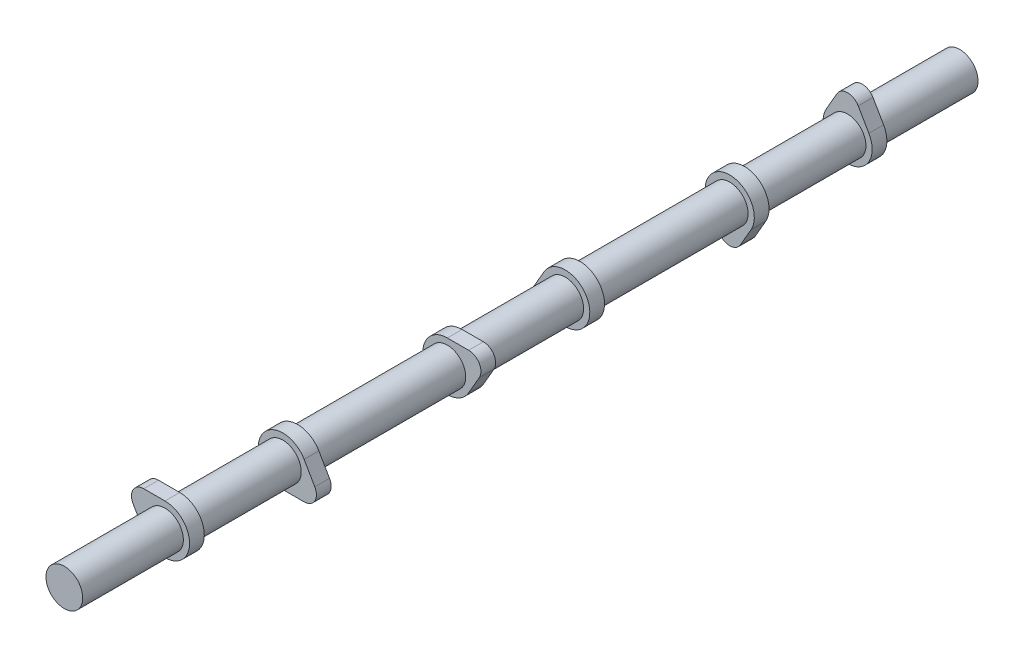
ISO-10303-21;
HEADER;
FILE_DESCRIPTION(('STEP AP214'),'2;1');
FILE_NAME('part.step','',(''),(''),'','','');
FILE_SCHEMA(('AUTOMOTIVE_DESIGN { 1 0 10303 214 1 1 1 1 }'));
ENDSEC;
DATA;
#1=APPLICATION_CONTEXT('core data for automotive mechanical design processes');
#2=APPLICATION_PROTOCOL_DEFINITION('international standard','automotive_design',2000,#1);
#3=PRODUCT_CONTEXT('',#1,'mechanical');
#4=PRODUCT('Part','Part','',(#3));
#5=PRODUCT_RELATED_PRODUCT_CATEGORY('part','',(#4));
#6=PRODUCT_DEFINITION_FORMATION('','',#4);
#7=PRODUCT_DEFINITION_CONTEXT('part definition',#1,'design');
#8=PRODUCT_DEFINITION('design','',#6,#7);
#9=PRODUCT_DEFINITION_SHAPE('','',#8);
#10=(LENGTH_UNIT() NAMED_UNIT(*) SI_UNIT(.MILLI.,.METRE.));
#11=(NAMED_UNIT(*) PLANE_ANGLE_UNIT() SI_UNIT($,.RADIAN.));
#12=(NAMED_UNIT(*) SI_UNIT($,.STERADIAN.) SOLID_ANGLE_UNIT());
#13=UNCERTAINTY_MEASURE_WITH_UNIT(LENGTH_MEASURE(1.E-05),#10,'distance_accuracy_value','');
#14=(GEOMETRIC_REPRESENTATION_CONTEXT(3) GLOBAL_UNCERTAINTY_ASSIGNED_CONTEXT((#13)) GLOBAL_UNIT_ASSIGNED_CONTEXT((#10,
#11,#12)) REPRESENTATION_CONTEXT('',''));
#15=CARTESIAN_POINT('',(0.,0.,0.));
#16=DIRECTION('',(0.,0.,1.));
#17=DIRECTION('',(1.,0.,0.));
#18=AXIS2_PLACEMENT_3D('',#15,#16,#17);
#19=CARTESIAN_POINT('',(0.,0.,120.65));
#20=DIRECTION('',(0.,0.,-1.));
#21=DIRECTION('',(-1.,0.,0.));
#22=AXIS2_PLACEMENT_3D('',#19,#20,#21);
#23=CYLINDRICAL_SURFACE('',#22,9.5);
#24=CARTESIAN_POINT('',(0.,0.,7.62));
#25=DIRECTION('',(0.,0.,1.));
#26=DIRECTION('',(1.,0.,0.));
#27=AXIS2_PLACEMENT_3D('',#24,#25,#26);
#28=CIRCLE('',#27,9.5);
#29=CARTESIAN_POINT('',(9.5,0.,7.62));
#30=VERTEX_POINT('',#29);
#31=EDGE_CURVE('E388',#30,#30,#28,.F.);
#32=ORIENTED_EDGE('',*,*,#31,.F.);
#33=EDGE_LOOP('',(#32));
#34=FACE_BOUND('',#33,.T.);
#35=CARTESIAN_POINT('',(0.,0.,60.96));
#36=DIRECTION('',(0.,0.,1.));
#37=DIRECTION('',(1.,0.,0.));
#38=AXIS2_PLACEMENT_3D('',#35,#36,#37);
#39=CIRCLE('',#38,9.5);
#40=CARTESIAN_POINT('',(9.5,0.,60.96));
#41=VERTEX_POINT('',#40);
#42=EDGE_CURVE('E11',#41,#41,#39,.T.);
#43=ORIENTED_EDGE('',*,*,#42,.F.);
#44=EDGE_LOOP('',(#43));
#45=FACE_BOUND('',#44,.T.);
#46=ADVANCED_FACE('F35',(#34,#45),#23,.T.);
#47=CARTESIAN_POINT('',(0.,0.,7.62));
#48=DIRECTION('',(0.,0.,-1.));
#49=DIRECTION('',(-1.,0.,0.));
#50=AXIS2_PLACEMENT_3D('',#47,#48,#49);
#51=CYLINDRICAL_SURFACE('',#50,12.7);
#52=CARTESIAN_POINT('',(0.,0.,0.));
#53=DIRECTION('',(0.,0.,1.));
#54=DIRECTION('',(1.,0.,0.));
#55=AXIS2_PLACEMENT_3D('',#52,#53,#54);
#56=CIRCLE('',#55,12.7);
#57=CARTESIAN_POINT('',(-10.9985226280624,6.35,0.));
#58=VERTEX_POINT('',#57);
#59=CARTESIAN_POINT('',(10.9985226280624,6.35,0.));
#60=VERTEX_POINT('',#59);
#61=EDGE_CURVE('E391',#58,#60,#56,.T.);
#62=ORIENTED_EDGE('',*,*,#61,.T.);
#63=DIRECTION('',(0.,0.,-1.));
#64=VECTOR('',#63,1.);
#65=CARTESIAN_POINT('',(10.9985226280624,6.35,7.62));
#66=LINE('',#65,#64);
#67=CARTESIAN_POINT('',(10.9985226280624,6.35,7.62));
#68=VERTEX_POINT('',#67);
#69=EDGE_CURVE('E410',#68,#60,#66,.T.);
#70=ORIENTED_EDGE('',*,*,#69,.F.);
#71=CARTESIAN_POINT('',(0.,0.,7.62));
#72=DIRECTION('',(0.,0.,1.));
#73=DIRECTION('',(1.,0.,0.));
#74=AXIS2_PLACEMENT_3D('',#71,#72,#73);
#75=CIRCLE('',#74,12.7);
#76=CARTESIAN_POINT('',(-10.9985226280624,6.35,7.62));
#77=VERTEX_POINT('',#76);
#78=EDGE_CURVE('E392',#77,#68,#75,.T.);
#79=ORIENTED_EDGE('',*,*,#78,.F.);
#80=DIRECTION('',(0.,0.,-1.));
#81=VECTOR('',#80,1.);
#82=CARTESIAN_POINT('',(-10.9985226280624,6.35,7.62));
#83=LINE('',#82,#81);
#84=EDGE_CURVE('E398',#77,#58,#83,.T.);
#85=ORIENTED_EDGE('',*,*,#84,.T.);
#86=EDGE_LOOP('',(#62,#70,#79,#85));
#87=FACE_BOUND('',#86,.T.);
#88=ADVANCED_FACE('F37',(#87),#51,.T.);
#89=CARTESIAN_POINT('',(10.9985226280624,6.35,7.62));
#90=DIRECTION('',(-0.866025403784439,-0.5,0.));
#91=DIRECTION('',(0.5,-0.866025403784439,0.));
#92=AXIS2_PLACEMENT_3D('',#89,#90,#91);
#93=PLANE('',#92);
#94=DIRECTION('',(-0.5,0.866025403784439,0.));
#95=VECTOR('',#94,1.);
#96=CARTESIAN_POINT('',(10.9985226280624,6.35,0.));
#97=LINE('',#96,#95);
#98=CARTESIAN_POINT('',(5.49926131403119,15.875,0.));
#99=VERTEX_POINT('',#98);
#100=EDGE_CURVE('E401',#60,#99,#97,.T.);
#101=ORIENTED_EDGE('',*,*,#100,.T.);
#102=DIRECTION('',(0.,0.,-1.));
#103=VECTOR('',#102,1.);
#104=CARTESIAN_POINT('',(5.49926131403119,15.875,7.62));
#105=LINE('',#104,#103);
#106=CARTESIAN_POINT('',(5.49926131403119,15.875,7.62));
#107=VERTEX_POINT('',#106);
#108=EDGE_CURVE('E408',#107,#99,#105,.T.);
#109=ORIENTED_EDGE('',*,*,#108,.F.);
#110=DIRECTION('',(-0.5,0.866025403784439,0.));
#111=VECTOR('',#110,1.);
#112=CARTESIAN_POINT('',(10.9985226280624,6.35,7.62));
#113=LINE('',#112,#111);
#114=EDGE_CURVE('E85',#68,#107,#113,.T.);
#115=ORIENTED_EDGE('',*,*,#114,.F.);
#116=ORIENTED_EDGE('',*,*,#69,.T.);
#117=EDGE_LOOP('',(#101,#109,#115,#116));
#118=FACE_BOUND('',#117,.T.);
#119=ADVANCED_FACE('F430',(#118),#93,.F.);
#120=CARTESIAN_POINT('',(0.,12.7,7.62));
#121=DIRECTION('',(0.,0.,-1.));
#122=DIRECTION('',(-1.,0.,0.));
#123=AXIS2_PLACEMENT_3D('',#120,#121,#122);
#124=CYLINDRICAL_SURFACE('',#123,6.35);
#125=CARTESIAN_POINT('',(0.,12.7,0.));
#126=DIRECTION('',(0.,0.,1.));
#127=DIRECTION('',(1.,0.,0.));
#128=AXIS2_PLACEMENT_3D('',#125,#126,#127);
#129=CIRCLE('',#128,6.35);
#130=CARTESIAN_POINT('',(-5.49926131403118,15.875,0.));
#131=VERTEX_POINT('',#130);
#132=EDGE_CURVE('E71',#99,#131,#129,.T.);
#133=ORIENTED_EDGE('',*,*,#132,.T.);
#134=DIRECTION('',(0.,0.,-1.));
#135=VECTOR('',#134,1.);
#136=CARTESIAN_POINT('',(-5.49926131403118,15.875,7.62));
#137=LINE('',#136,#135);
#138=CARTESIAN_POINT('',(-5.49926131403118,15.875,7.62));
#139=VERTEX_POINT('',#138);
#140=EDGE_CURVE('E406',#139,#131,#137,.T.);
#141=ORIENTED_EDGE('',*,*,#140,.F.);
#142=CARTESIAN_POINT('',(0.,12.7,7.62));
#143=DIRECTION('',(0.,0.,1.));
#144=DIRECTION('',(1.,0.,0.));
#145=AXIS2_PLACEMENT_3D('',#142,#143,#144);
#146=CIRCLE('',#145,6.35);
#147=EDGE_CURVE('E395',#107,#139,#146,.T.);
#148=ORIENTED_EDGE('',*,*,#147,.F.);
#149=ORIENTED_EDGE('',*,*,#108,.T.);
#150=EDGE_LOOP('',(#133,#141,#148,#149));
#151=FACE_BOUND('',#150,.T.);
#152=ADVANCED_FACE('F429',(#151),#124,.T.);
#153=CARTESIAN_POINT('',(-10.9985226280624,6.35,7.62));
#154=DIRECTION('',(0.866025403784439,-0.5,0.));
#155=DIRECTION('',(0.5,0.866025403784439,0.));
#156=AXIS2_PLACEMENT_3D('',#153,#154,#155);
#157=PLANE('',#156);
#158=DIRECTION('',(-0.5,-0.866025403784439,0.));
#159=VECTOR('',#158,1.);
#160=CARTESIAN_POINT('',(-10.9985226280624,6.35,0.));
#161=LINE('',#160,#159);
#162=EDGE_CURVE('E77',#131,#58,#161,.T.);
#163=ORIENTED_EDGE('',*,*,#162,.T.);
#164=ORIENTED_EDGE('',*,*,#84,.F.);
#165=DIRECTION('',(-0.5,-0.866025403784439,0.));
#166=VECTOR('',#165,1.);
#167=CARTESIAN_POINT('',(-10.9985226280624,6.35,7.62));
#168=LINE('',#167,#166);
#169=EDGE_CURVE('E53',#139,#77,#168,.T.);
#170=ORIENTED_EDGE('',*,*,#169,.F.);
#171=ORIENTED_EDGE('',*,*,#140,.T.);
#172=EDGE_LOOP('',(#163,#164,#170,#171));
#173=FACE_BOUND('',#172,.T.);
#174=ADVANCED_FACE('F427',(#173),#157,.F.);
#175=CARTESIAN_POINT('',(0.,0.,7.62));
#176=DIRECTION('',(0.,0.,1.));
#177=DIRECTION('',(1.,0.,0.));
#178=AXIS2_PLACEMENT_3D('',#175,#176,#177);
#179=PLANE('',#178);
#180=ORIENTED_EDGE('',*,*,#31,.T.);
#181=EDGE_LOOP('',(#180));
#182=FACE_BOUND('',#181,.T.);
#183=ORIENTED_EDGE('',*,*,#78,.T.);
#184=ORIENTED_EDGE('',*,*,#114,.T.);
#185=ORIENTED_EDGE('',*,*,#147,.T.);
#186=ORIENTED_EDGE('',*,*,#169,.T.);
#187=EDGE_LOOP('',(#183,#184,#185,#186));
#188=FACE_BOUND('',#187,.T.);
#189=ADVANCED_FACE('F421',(#182,#188),#179,.T.);
#190=CARTESIAN_POINT('',(0.,0.,0.));
#191=DIRECTION('',(0.,0.,1.));
#192=DIRECTION('',(1.,0.,0.));
#193=AXIS2_PLACEMENT_3D('',#190,#191,#192);
#194=PLANE('',#193);
#195=CARTESIAN_POINT('',(0.,0.,0.));
#196=DIRECTION('',(0.,0.,1.));
#197=DIRECTION('',(1.,0.,0.));
#198=AXIS2_PLACEMENT_3D('',#195,#196,#197);
#199=CIRCLE('',#198,9.5);
#200=CARTESIAN_POINT('',(9.5,0.,0.));
#201=VERTEX_POINT('',#200);
#202=EDGE_CURVE('E45',#201,#201,#199,.F.);
#203=ORIENTED_EDGE('',*,*,#202,.F.);
#204=EDGE_LOOP('',(#203));
#205=FACE_BOUND('',#204,.T.);
#206=ORIENTED_EDGE('',*,*,#61,.F.);
#207=ORIENTED_EDGE('',*,*,#162,.F.);
#208=ORIENTED_EDGE('',*,*,#132,.F.);
#209=ORIENTED_EDGE('',*,*,#100,.F.);
#210=EDGE_LOOP('',(#206,#207,#208,#209));
#211=FACE_BOUND('',#210,.T.);
#212=ADVANCED_FACE('F418',(#205,#211),#194,.F.);
#213=ORIENTED_EDGE('',*,*,#202,.T.);
#214=EDGE_LOOP('',(#213));
#215=FACE_BOUND('',#214,.T.);
#216=CARTESIAN_POINT('',(0.,0.,-50.34));
#217=DIRECTION('',(0.,0.,-1.));
#218=DIRECTION('',(-1.,0.,0.));
#219=AXIS2_PLACEMENT_3D('',#216,#217,#218);
#220=CIRCLE('',#219,9.5);
#221=CARTESIAN_POINT('',(-9.5,0.,-50.34));
#222=VERTEX_POINT('',#221);
#223=EDGE_CURVE('E353',#222,#222,#220,.T.);
#224=ORIENTED_EDGE('',*,*,#223,.F.);
#225=EDGE_LOOP('',(#224));
#226=FACE_BOUND('',#225,.T.);
#227=ADVANCED_FACE('F415',(#215,#226),#23,.T.);
#228=CARTESIAN_POINT('',(0.,0.,68.58));
#229=DIRECTION('',(0.,0.,-1.));
#230=DIRECTION('',(1.,0.,0.));
#231=AXIS2_PLACEMENT_3D('',#228,#229,#230);
#232=CYLINDRICAL_SURFACE('',#231,12.7);
#233=CARTESIAN_POINT('',(0.,0.,60.96));
#234=DIRECTION('',(0.,0.,1.));
#235=DIRECTION('',(-1.,0.,0.));
#236=AXIS2_PLACEMENT_3D('',#233,#234,#235);
#237=CIRCLE('',#236,12.7);
#238=CARTESIAN_POINT('',(10.9985226280623,-6.35000000000008,60.96));
#239=VERTEX_POINT('',#238);
#240=CARTESIAN_POINT('',(-10.9985226280624,-6.34999999999992,60.96));
#241=VERTEX_POINT('',#240);
#242=EDGE_CURVE('E358',#239,#241,#237,.T.);
#243=ORIENTED_EDGE('',*,*,#242,.T.);
#244=DIRECTION('',(0.,0.,-1.));
#245=VECTOR('',#244,1.);
#246=CARTESIAN_POINT('',(-10.9985226280624,-6.34999999999992,68.58));
#247=LINE('',#246,#245);
#248=CARTESIAN_POINT('',(-10.9985226280624,-6.34999999999992,68.58));
#249=VERTEX_POINT('',#248);
#250=EDGE_CURVE('E385',#249,#241,#247,.T.);
#251=ORIENTED_EDGE('',*,*,#250,.F.);
#252=CARTESIAN_POINT('',(0.,0.,68.58));
#253=DIRECTION('',(0.,0.,1.));
#254=DIRECTION('',(-1.,0.,0.));
#255=AXIS2_PLACEMENT_3D('',#252,#253,#254);
#256=CIRCLE('',#255,12.7);
#257=CARTESIAN_POINT('',(10.9985226280623,-6.35000000000008,68.58));
#258=VERTEX_POINT('',#257);
#259=EDGE_CURVE('E359',#258,#249,#256,.T.);
#260=ORIENTED_EDGE('',*,*,#259,.F.);
#261=DIRECTION('',(0.,0.,-1.));
#262=VECTOR('',#261,1.);
#263=CARTESIAN_POINT('',(10.9985226280623,-6.35000000000008,68.58));
#264=LINE('',#263,#262);
#265=EDGE_CURVE('E369',#258,#239,#264,.T.);
#266=ORIENTED_EDGE('',*,*,#265,.T.);
#267=EDGE_LOOP('',(#243,#251,#260,#266));
#268=FACE_BOUND('',#267,.T.);
#269=ADVANCED_FACE('F448',(#268),#232,.T.);
#270=CARTESIAN_POINT('',(-10.9985226280624,-6.34999999999992,68.58));
#271=DIRECTION('',(0.866025403784442,0.499999999999994,0.));
#272=DIRECTION('',(-0.499999999999994,0.866025403784442,0.));
#273=AXIS2_PLACEMENT_3D('',#270,#271,#272);
#274=PLANE('',#273);
#275=DIRECTION('',(0.499999999999994,-0.866025403784442,0.));
#276=VECTOR('',#275,1.);
#277=CARTESIAN_POINT('',(-10.9985226280624,-6.34999999999992,60.96));
#278=LINE('',#277,#276);
#279=CARTESIAN_POINT('',(-5.4992613140313,-15.875,60.96));
#280=VERTEX_POINT('',#279);
#281=EDGE_CURVE('E372',#241,#280,#278,.T.);
#282=ORIENTED_EDGE('',*,*,#281,.T.);
#283=DIRECTION('',(0.,0.,-1.));
#284=VECTOR('',#283,1.);
#285=CARTESIAN_POINT('',(-5.4992613140313,-15.875,68.58));
#286=LINE('',#285,#284);
#287=CARTESIAN_POINT('',(-5.4992613140313,-15.875,68.58));
#288=VERTEX_POINT('',#287);
#289=EDGE_CURVE('E382',#288,#280,#286,.T.);
#290=ORIENTED_EDGE('',*,*,#289,.F.);
#291=DIRECTION('',(0.499999999999994,-0.866025403784442,0.));
#292=VECTOR('',#291,1.);
#293=CARTESIAN_POINT('',(-10.9985226280624,-6.34999999999992,68.58));
#294=LINE('',#293,#292);
#295=EDGE_CURVE('E362',#249,#288,#294,.T.);
#296=ORIENTED_EDGE('',*,*,#295,.F.);
#297=ORIENTED_EDGE('',*,*,#250,.T.);
#298=EDGE_LOOP('',(#282,#290,#296,#297));
#299=FACE_BOUND('',#298,.T.);
#300=ADVANCED_FACE('F520',(#299),#274,.F.);
#301=CARTESIAN_POINT('',(0.,-12.7,68.58));
#302=DIRECTION('',(0.,0.,-1.));
#303=DIRECTION('',(1.,0.,0.));
#304=AXIS2_PLACEMENT_3D('',#301,#302,#303);
#305=CYLINDRICAL_SURFACE('',#304,6.35);
#306=CARTESIAN_POINT('',(0.,-12.7,60.96));
#307=DIRECTION('',(0.,0.,1.));
#308=DIRECTION('',(-1.,0.,0.));
#309=AXIS2_PLACEMENT_3D('',#306,#307,#308);
#310=CIRCLE('',#309,6.35);
#311=CARTESIAN_POINT('',(5.49926131403107,-15.875,60.96));
#312=VERTEX_POINT('',#311);
#313=EDGE_CURVE('E374',#280,#312,#310,.T.);
#314=ORIENTED_EDGE('',*,*,#313,.T.);
#315=DIRECTION('',(0.,0.,-1.));
#316=VECTOR('',#315,1.);
#317=CARTESIAN_POINT('',(5.49926131403107,-15.875,68.58));
#318=LINE('',#317,#316);
#319=CARTESIAN_POINT('',(5.49926131403107,-15.875,68.58));
#320=VERTEX_POINT('',#319);
#321=EDGE_CURVE('E379',#320,#312,#318,.T.);
#322=ORIENTED_EDGE('',*,*,#321,.F.);
#323=CARTESIAN_POINT('',(0.,-12.7,68.58));
#324=DIRECTION('',(0.,0.,1.));
#325=DIRECTION('',(-1.,0.,0.));
#326=AXIS2_PLACEMENT_3D('',#323,#324,#325);
#327=CIRCLE('',#326,6.35);
#328=EDGE_CURVE('E365',#288,#320,#327,.T.);
#329=ORIENTED_EDGE('',*,*,#328,.F.);
#330=ORIENTED_EDGE('',*,*,#289,.T.);
#331=EDGE_LOOP('',(#314,#322,#329,#330));
#332=FACE_BOUND('',#331,.T.);
#333=ADVANCED_FACE('F516',(#332),#305,.T.);
#334=CARTESIAN_POINT('',(10.9985226280623,-6.35000000000008,68.58));
#335=DIRECTION('',(-0.866025403784435,0.500000000000006,0.));
#336=DIRECTION('',(-0.500000000000006,-0.866025403784435,0.));
#337=AXIS2_PLACEMENT_3D('',#334,#335,#336);
#338=PLANE('',#337);
#339=DIRECTION('',(0.500000000000006,0.866025403784435,0.));
#340=VECTOR('',#339,1.);
#341=CARTESIAN_POINT('',(10.9985226280623,-6.35000000000008,60.96));
#342=LINE('',#341,#340);
#343=EDGE_CURVE('E363',#312,#239,#342,.T.);
#344=ORIENTED_EDGE('',*,*,#343,.T.);
#345=ORIENTED_EDGE('',*,*,#265,.F.);
#346=DIRECTION('',(0.500000000000006,0.866025403784435,0.));
#347=VECTOR('',#346,1.);
#348=CARTESIAN_POINT('',(10.9985226280623,-6.35000000000008,68.58));
#349=LINE('',#348,#347);
#350=EDGE_CURVE('E367',#320,#258,#349,.T.);
#351=ORIENTED_EDGE('',*,*,#350,.F.);
#352=ORIENTED_EDGE('',*,*,#321,.T.);
#353=EDGE_LOOP('',(#344,#345,#351,#352));
#354=FACE_BOUND('',#353,.T.);
#355=ADVANCED_FACE('F511',(#354),#338,.F.);
#356=CARTESIAN_POINT('',(0.,0.,68.58));
#357=DIRECTION('',(0.,0.,1.));
#358=DIRECTION('',(-1.,0.,0.));
#359=AXIS2_PLACEMENT_3D('',#356,#357,#358);
#360=PLANE('',#359);
#361=CARTESIAN_POINT('',(0.,0.,68.58));
#362=DIRECTION('',(0.,0.,1.));
#363=DIRECTION('',(1.,0.,0.));
#364=AXIS2_PLACEMENT_3D('',#361,#362,#363);
#365=CIRCLE('',#364,9.5);
#366=CARTESIAN_POINT('',(9.5,0.,68.58));
#367=VERTEX_POINT('',#366);
#368=EDGE_CURVE('E39',#367,#367,#365,.T.);
#369=ORIENTED_EDGE('',*,*,#368,.F.);
#370=EDGE_LOOP('',(#369));
#371=FACE_BOUND('',#370,.T.);
#372=ORIENTED_EDGE('',*,*,#259,.T.);
#373=ORIENTED_EDGE('',*,*,#295,.T.);
#374=ORIENTED_EDGE('',*,*,#328,.T.);
#375=ORIENTED_EDGE('',*,*,#350,.T.);
#376=EDGE_LOOP('',(#372,#373,#374,#375));
#377=FACE_BOUND('',#376,.T.);
#378=ADVANCED_FACE('F460',(#371,#377),#360,.T.);
#379=CARTESIAN_POINT('',(0.,0.,60.96));
#380=DIRECTION('',(0.,0.,1.));
#381=DIRECTION('',(-1.,0.,0.));
#382=AXIS2_PLACEMENT_3D('',#379,#380,#381);
#383=PLANE('',#382);
#384=ORIENTED_EDGE('',*,*,#42,.T.);
#385=EDGE_LOOP('',(#384));
#386=FACE_BOUND('',#385,.T.);
#387=ORIENTED_EDGE('',*,*,#242,.F.);
#388=ORIENTED_EDGE('',*,*,#343,.F.);
#389=ORIENTED_EDGE('',*,*,#313,.F.);
#390=ORIENTED_EDGE('',*,*,#281,.F.);
#391=EDGE_LOOP('',(#387,#388,#389,#390));
#392=FACE_BOUND('',#391,.T.);
#393=ADVANCED_FACE('F451',(#386,#392),#383,.F.);
#394=ORIENTED_EDGE('',*,*,#368,.T.);
#395=EDGE_LOOP('',(#394));
#396=FACE_BOUND('',#395,.T.);
#397=CARTESIAN_POINT('',(0.,0.,146.05));
#398=DIRECTION('',(0.,0.,1.));
#399=DIRECTION('',(-0.500000000000004,0.866025403784436,0.));
#400=AXIS2_PLACEMENT_3D('',#397,#398,#399);
#401=CIRCLE('',#400,9.5);
#402=CARTESIAN_POINT('',(-4.75000000000004,8.22724133595215,146.05));
#403=VERTEX_POINT('',#402);
#404=EDGE_CURVE('E347',#403,#403,#401,.F.);
#405=ORIENTED_EDGE('',*,*,#404,.T.);
#406=EDGE_LOOP('',(#405));
#407=FACE_BOUND('',#406,.T.);
#408=ADVANCED_FACE('F440',(#396,#407),#23,.T.);
#409=CARTESIAN_POINT('',(0.,0.,-50.34));
#410=DIRECTION('',(0.,0.,-1.));
#411=DIRECTION('',(-1.,0.,0.));
#412=AXIS2_PLACEMENT_3D('',#409,#410,#411);
#413=PLANE('',#412);
#414=ORIENTED_EDGE('',*,*,#223,.T.);
#415=EDGE_LOOP('',(#414));
#416=FACE_BOUND('',#415,.T.);
#417=ADVANCED_FACE('F450',(#416),#413,.T.);
#418=CARTESIAN_POINT('',(0.,0.,266.7));
#419=DIRECTION('',(0.,0.,-1.));
#420=DIRECTION('',(0.500000000000004,-0.866025403784436,0.));
#421=AXIS2_PLACEMENT_3D('',#418,#419,#420);
#422=CYLINDRICAL_SURFACE('',#421,9.5);
#423=CARTESIAN_POINT('',(0.,0.,153.67));
#424=DIRECTION('',(0.,0.,1.));
#425=DIRECTION('',(-0.500000000000004,0.866025403784436,0.));
#426=AXIS2_PLACEMENT_3D('',#423,#424,#425);
#427=CIRCLE('',#426,9.5);
#428=CARTESIAN_POINT('',(-4.75000000000004,8.22724133595215,153.67));
#429=VERTEX_POINT('',#428);
#430=EDGE_CURVE('E314',#429,#429,#427,.F.);
#431=ORIENTED_EDGE('',*,*,#430,.F.);
#432=EDGE_LOOP('',(#431));
#433=FACE_BOUND('',#432,.T.);
#434=CARTESIAN_POINT('',(0.,0.,207.01));
#435=DIRECTION('',(0.,0.,1.));
#436=DIRECTION('',(-0.500000000000004,0.866025403784436,0.));
#437=AXIS2_PLACEMENT_3D('',#434,#435,#436);
#438=CIRCLE('',#437,9.5);
#439=CARTESIAN_POINT('',(-4.75000000000004,8.22724133595215,207.01));
#440=VERTEX_POINT('',#439);
#441=EDGE_CURVE('E350',#440,#440,#438,.T.);
#442=ORIENTED_EDGE('',*,*,#441,.F.);
#443=EDGE_LOOP('',(#442));
#444=FACE_BOUND('',#443,.T.);
#445=ADVANCED_FACE('F457',(#433,#444),#422,.T.);
#446=CARTESIAN_POINT('',(0.,0.,153.67));
#447=DIRECTION('',(0.,0.,-1.));
#448=DIRECTION('',(0.500000000000004,-0.866025403784436,0.));
#449=AXIS2_PLACEMENT_3D('',#446,#447,#448);
#450=CYLINDRICAL_SURFACE('',#449,12.7);
#451=CARTESIAN_POINT('',(0.,0.,146.05));
#452=DIRECTION('',(0.,0.,1.));
#453=DIRECTION('',(-0.500000000000004,0.866025403784436,0.));
#454=AXIS2_PLACEMENT_3D('',#451,#452,#453);
#455=CIRCLE('',#454,12.7);
#456=CARTESIAN_POINT('',(0.,-12.7,146.05));
#457=VERTEX_POINT('',#456);
#458=CARTESIAN_POINT('',(-10.9985226280624,6.34999999999995,146.05));
#459=VERTEX_POINT('',#458);
#460=EDGE_CURVE('E317',#457,#459,#455,.T.);
#461=ORIENTED_EDGE('',*,*,#460,.T.);
#462=DIRECTION('',(0.,0.,-1.));
#463=VECTOR('',#462,1.);
#464=CARTESIAN_POINT('',(-10.9985226280624,6.34999999999995,153.67));
#465=LINE('',#464,#463);
#466=CARTESIAN_POINT('',(-10.9985226280624,6.34999999999995,153.67));
#467=VERTEX_POINT('',#466);
#468=EDGE_CURVE('E344',#467,#459,#465,.T.);
#469=ORIENTED_EDGE('',*,*,#468,.F.);
#470=CARTESIAN_POINT('',(0.,0.,153.67));
#471=DIRECTION('',(0.,0.,1.));
#472=DIRECTION('',(-0.500000000000004,0.866025403784436,0.));
#473=AXIS2_PLACEMENT_3D('',#470,#471,#472);
#474=CIRCLE('',#473,12.7);
#475=CARTESIAN_POINT('',(0.,-12.7,153.67));
#476=VERTEX_POINT('',#475);
#477=EDGE_CURVE('E318',#476,#467,#474,.T.);
#478=ORIENTED_EDGE('',*,*,#477,.F.);
#479=DIRECTION('',(0.,0.,-1.));
#480=VECTOR('',#479,1.);
#481=CARTESIAN_POINT('',(0.,-12.7,153.67));
#482=LINE('',#481,#480);
#483=EDGE_CURVE('E328',#476,#457,#482,.T.);
#484=ORIENTED_EDGE('',*,*,#483,.T.);
#485=EDGE_LOOP('',(#461,#469,#478,#484));
#486=FACE_BOUND('',#485,.T.);
#487=ADVANCED_FACE('F479',(#486),#450,.T.);
#488=CARTESIAN_POINT('',(-10.9985226280624,6.34999999999995,153.67));
#489=DIRECTION('',(0.866025403784441,-0.499999999999996,0.));
#490=DIRECTION('',(0.499999999999996,0.866025403784441,0.));
#491=AXIS2_PLACEMENT_3D('',#488,#489,#490);
#492=PLANE('',#491);
#493=DIRECTION('',(-0.499999999999996,-0.866025403784441,0.));
#494=VECTOR('',#493,1.);
#495=CARTESIAN_POINT('',(-10.9985226280624,6.34999999999995,146.05));
#496=LINE('',#495,#494);
#497=CARTESIAN_POINT('',(-16.4977839420935,-3.17500000000008,146.05));
#498=VERTEX_POINT('',#497);
#499=EDGE_CURVE('E331',#459,#498,#496,.T.);
#500=ORIENTED_EDGE('',*,*,#499,.T.);
#501=DIRECTION('',(0.,0.,-1.));
#502=VECTOR('',#501,1.);
#503=CARTESIAN_POINT('',(-16.4977839420935,-3.17500000000008,153.67));
#504=LINE('',#503,#502);
#505=CARTESIAN_POINT('',(-16.4977839420935,-3.17500000000008,153.67));
#506=VERTEX_POINT('',#505);
#507=EDGE_CURVE('E341',#506,#498,#504,.T.);
#508=ORIENTED_EDGE('',*,*,#507,.F.);
#509=DIRECTION('',(-0.499999999999996,-0.866025403784441,0.));
#510=VECTOR('',#509,1.);
#511=CARTESIAN_POINT('',(-10.9985226280624,6.34999999999995,153.67));
#512=LINE('',#511,#510);
#513=EDGE_CURVE('E321',#467,#506,#512,.T.);
#514=ORIENTED_EDGE('',*,*,#513,.F.);
#515=ORIENTED_EDGE('',*,*,#468,.T.);
#516=EDGE_LOOP('',(#500,#508,#514,#515));
#517=FACE_BOUND('',#516,.T.);
#518=ADVANCED_FACE('F491',(#517),#492,.F.);
#519=CARTESIAN_POINT('',(-10.9985226280623,-6.35000000000005,153.67));
#520=DIRECTION('',(0.,0.,-1.));
#521=DIRECTION('',(0.500000000000004,-0.866025403784436,0.));
#522=AXIS2_PLACEMENT_3D('',#519,#520,#521);
#523=CYLINDRICAL_SURFACE('',#522,6.35);
#524=CARTESIAN_POINT('',(-10.9985226280623,-6.35000000000005,146.05));
#525=DIRECTION('',(0.,0.,1.));
#526=DIRECTION('',(-0.500000000000004,0.866025403784436,0.));
#527=AXIS2_PLACEMENT_3D('',#524,#525,#526);
#528=CIRCLE('',#527,6.35);
#529=CARTESIAN_POINT('',(-10.9985226280623,-12.7000000000001,146.05));
#530=VERTEX_POINT('',#529);
#531=EDGE_CURVE('E333',#498,#530,#528,.T.);
#532=ORIENTED_EDGE('',*,*,#531,.T.);
#533=DIRECTION('',(0.,0.,-1.));
#534=VECTOR('',#533,1.);
#535=CARTESIAN_POINT('',(-10.9985226280623,-12.7000000000001,153.67));
#536=LINE('',#535,#534);
#537=CARTESIAN_POINT('',(-10.9985226280623,-12.7000000000001,153.67));
#538=VERTEX_POINT('',#537);
#539=EDGE_CURVE('E338',#538,#530,#536,.T.);
#540=ORIENTED_EDGE('',*,*,#539,.F.);
#541=CARTESIAN_POINT('',(-10.9985226280623,-6.35000000000005,153.67));
#542=DIRECTION('',(0.,0.,1.));
#543=DIRECTION('',(-0.500000000000004,0.866025403784436,0.));
#544=AXIS2_PLACEMENT_3D('',#541,#542,#543);
#545=CIRCLE('',#544,6.35);
#546=EDGE_CURVE('E324',#506,#538,#545,.T.);
#547=ORIENTED_EDGE('',*,*,#546,.F.);
#548=ORIENTED_EDGE('',*,*,#507,.T.);
#549=EDGE_LOOP('',(#532,#540,#547,#548));
#550=FACE_BOUND('',#549,.T.);
#551=ADVANCED_FACE('F488',(#550),#523,.T.);
#552=CARTESIAN_POINT('',(0.,-12.7,153.67));
#553=DIRECTION('',(0.,1.,0.));
#554=DIRECTION('',(-1.,0.,0.));
#555=AXIS2_PLACEMENT_3D('',#552,#553,#554);
#556=PLANE('',#555);
#557=DIRECTION('',(1.,0.,0.));
#558=VECTOR('',#557,1.);
#559=CARTESIAN_POINT('',(0.,-12.7,146.05));
#560=LINE('',#559,#558);
#561=EDGE_CURVE('E322',#530,#457,#560,.T.);
#562=ORIENTED_EDGE('',*,*,#561,.T.);
#563=ORIENTED_EDGE('',*,*,#483,.F.);
#564=DIRECTION('',(1.,0.,0.));
#565=VECTOR('',#564,1.);
#566=CARTESIAN_POINT('',(0.,-12.7,153.67));
#567=LINE('',#566,#565);
#568=EDGE_CURVE('E326',#538,#476,#567,.T.);
#569=ORIENTED_EDGE('',*,*,#568,.F.);
#570=ORIENTED_EDGE('',*,*,#539,.T.);
#571=EDGE_LOOP('',(#562,#563,#569,#570));
#572=FACE_BOUND('',#571,.T.);
#573=ADVANCED_FACE('F484',(#572),#556,.F.);
#574=CARTESIAN_POINT('',(0.,0.,153.67));
#575=DIRECTION('',(0.,0.,1.));
#576=DIRECTION('',(-0.500000000000004,0.866025403784436,0.));
#577=AXIS2_PLACEMENT_3D('',#574,#575,#576);
#578=PLANE('',#577);
#579=ORIENTED_EDGE('',*,*,#430,.T.);
#580=EDGE_LOOP('',(#579));
#581=FACE_BOUND('',#580,.T.);
#582=ORIENTED_EDGE('',*,*,#477,.T.);
#583=ORIENTED_EDGE('',*,*,#513,.T.);
#584=ORIENTED_EDGE('',*,*,#546,.T.);
#585=ORIENTED_EDGE('',*,*,#568,.T.);
#586=EDGE_LOOP('',(#582,#583,#584,#585));
#587=FACE_BOUND('',#586,.T.);
#588=ADVANCED_FACE('F472',(#581,#587),#578,.T.);
#589=CARTESIAN_POINT('',(0.,0.,146.05));
#590=DIRECTION('',(0.,0.,1.));
#591=DIRECTION('',(-0.500000000000004,0.866025403784436,0.));
#592=AXIS2_PLACEMENT_3D('',#589,#590,#591);
#593=PLANE('',#592);
#594=ORIENTED_EDGE('',*,*,#404,.F.);
#595=EDGE_LOOP('',(#594));
#596=FACE_BOUND('',#595,.T.);
#597=ORIENTED_EDGE('',*,*,#460,.F.);
#598=ORIENTED_EDGE('',*,*,#561,.F.);
#599=ORIENTED_EDGE('',*,*,#531,.F.);
#600=ORIENTED_EDGE('',*,*,#499,.F.);
#601=EDGE_LOOP('',(#597,#598,#599,#600));
#602=FACE_BOUND('',#601,.T.);
#603=ADVANCED_FACE('F468',(#596,#602),#593,.F.);
#604=CARTESIAN_POINT('',(0.,0.,214.63));
#605=DIRECTION('',(0.,0.,-1.));
#606=DIRECTION('',(-0.499999999999998,0.86602540378444,0.));
#607=AXIS2_PLACEMENT_3D('',#604,#605,#606);
#608=CYLINDRICAL_SURFACE('',#607,12.7);
#609=CARTESIAN_POINT('',(0.,0.,207.01));
#610=DIRECTION('',(0.,0.,1.));
#611=DIRECTION('',(0.499999999999998,-0.86602540378444,0.));
#612=AXIS2_PLACEMENT_3D('',#609,#610,#611);
#613=CIRCLE('',#612,12.7);
#614=CARTESIAN_POINT('',(0.,12.7,207.01));
#615=VERTEX_POINT('',#614);
#616=CARTESIAN_POINT('',(10.9985226280624,-6.35000000000003,207.01));
#617=VERTEX_POINT('',#616);
#618=EDGE_CURVE('E282',#615,#617,#613,.T.);
#619=ORIENTED_EDGE('',*,*,#618,.T.);
#620=DIRECTION('',(0.,0.,-1.));
#621=VECTOR('',#620,1.);
#622=CARTESIAN_POINT('',(10.9985226280624,-6.35000000000003,214.63));
#623=LINE('',#622,#621);
#624=CARTESIAN_POINT('',(10.9985226280624,-6.35000000000003,214.63));
#625=VERTEX_POINT('',#624);
#626=EDGE_CURVE('E310',#625,#617,#623,.T.);
#627=ORIENTED_EDGE('',*,*,#626,.F.);
#628=CARTESIAN_POINT('',(0.,0.,214.63));
#629=DIRECTION('',(0.,0.,1.));
#630=DIRECTION('',(0.499999999999998,-0.86602540378444,0.));
#631=AXIS2_PLACEMENT_3D('',#628,#629,#630);
#632=CIRCLE('',#631,12.7);
#633=CARTESIAN_POINT('',(0.,12.7,214.63));
#634=VERTEX_POINT('',#633);
#635=EDGE_CURVE('E284',#634,#625,#632,.T.);
#636=ORIENTED_EDGE('',*,*,#635,.F.);
#637=DIRECTION('',(0.,0.,-1.));
#638=VECTOR('',#637,1.);
#639=CARTESIAN_POINT('',(0.,12.7,214.63));
#640=LINE('',#639,#638);
#641=EDGE_CURVE('E294',#634,#615,#640,.T.);
#642=ORIENTED_EDGE('',*,*,#641,.T.);
#643=EDGE_LOOP('',(#619,#627,#636,#642));
#644=FACE_BOUND('',#643,.T.);
#645=ADVANCED_FACE('F471',(#644),#608,.T.);
#646=CARTESIAN_POINT('',(10.9985226280624,-6.35000000000003,214.63));
#647=DIRECTION('',(-0.866025403784438,0.500000000000002,0.));
#648=DIRECTION('',(-0.500000000000002,-0.866025403784438,0.));
#649=AXIS2_PLACEMENT_3D('',#646,#647,#648);
#650=PLANE('',#649);
#651=DIRECTION('',(0.500000000000002,0.866025403784438,0.));
#652=VECTOR('',#651,1.);
#653=CARTESIAN_POINT('',(10.9985226280624,-6.35000000000003,207.01));
#654=LINE('',#653,#652);
#655=CARTESIAN_POINT('',(16.4977839420936,3.17499999999996,207.01));
#656=VERTEX_POINT('',#655);
#657=EDGE_CURVE('E297',#617,#656,#654,.T.);
#658=ORIENTED_EDGE('',*,*,#657,.T.);
#659=DIRECTION('',(0.,0.,-1.));
#660=VECTOR('',#659,1.);
#661=CARTESIAN_POINT('',(16.4977839420936,3.17499999999996,214.63));
#662=LINE('',#661,#660);
#663=CARTESIAN_POINT('',(16.4977839420936,3.17499999999996,214.63));
#664=VERTEX_POINT('',#663);
#665=EDGE_CURVE('E307',#664,#656,#662,.T.);
#666=ORIENTED_EDGE('',*,*,#665,.F.);
#667=DIRECTION('',(0.500000000000002,0.866025403784438,0.));
#668=VECTOR('',#667,1.);
#669=CARTESIAN_POINT('',(10.9985226280624,-6.35000000000003,214.63));
#670=LINE('',#669,#668);
#671=EDGE_CURVE('E287',#625,#664,#670,.T.);
#672=ORIENTED_EDGE('',*,*,#671,.F.);
#673=ORIENTED_EDGE('',*,*,#626,.T.);
#674=EDGE_LOOP('',(#658,#666,#672,#673));
#675=FACE_BOUND('',#674,.T.);
#676=ADVANCED_FACE('F648',(#675),#650,.F.);
#677=CARTESIAN_POINT('',(10.9985226280624,6.34999999999997,214.63));
#678=DIRECTION('',(0.,0.,-1.));
#679=DIRECTION('',(-0.499999999999998,0.86602540378444,0.));
#680=AXIS2_PLACEMENT_3D('',#677,#678,#679);
#681=CYLINDRICAL_SURFACE('',#680,6.35);
#682=CARTESIAN_POINT('',(10.9985226280624,6.34999999999997,207.01));
#683=DIRECTION('',(0.,0.,1.));
#684=DIRECTION('',(0.499999999999998,-0.86602540378444,0.));
#685=AXIS2_PLACEMENT_3D('',#682,#683,#684);
#686=CIRCLE('',#685,6.35);
#687=CARTESIAN_POINT('',(10.9985226280624,12.7,207.01));
#688=VERTEX_POINT('',#687);
#689=EDGE_CURVE('E299',#656,#688,#686,.T.);
#690=ORIENTED_EDGE('',*,*,#689,.T.);
#691=DIRECTION('',(0.,0.,-1.));
#692=VECTOR('',#691,1.);
#693=CARTESIAN_POINT('',(10.9985226280624,12.7,214.63));
#694=LINE('',#693,#692);
#695=CARTESIAN_POINT('',(10.9985226280624,12.7,214.63));
#696=VERTEX_POINT('',#695);
#697=EDGE_CURVE('E304',#696,#688,#694,.T.);
#698=ORIENTED_EDGE('',*,*,#697,.F.);
#699=CARTESIAN_POINT('',(10.9985226280624,6.34999999999997,214.63));
#700=DIRECTION('',(0.,0.,1.));
#701=DIRECTION('',(0.499999999999998,-0.86602540378444,0.));
#702=AXIS2_PLACEMENT_3D('',#699,#700,#701);
#703=CIRCLE('',#702,6.35);
#704=EDGE_CURVE('E290',#664,#696,#703,.T.);
#705=ORIENTED_EDGE('',*,*,#704,.F.);
#706=ORIENTED_EDGE('',*,*,#665,.T.);
#707=EDGE_LOOP('',(#690,#698,#705,#706));
#708=FACE_BOUND('',#707,.T.);
#709=ADVANCED_FACE('F657',(#708),#681,.T.);
#710=CARTESIAN_POINT('',(0.,12.7,214.63));
#711=DIRECTION('',(0.,-1.,0.));
#712=DIRECTION('',(1.,0.,0.));
#713=AXIS2_PLACEMENT_3D('',#710,#711,#712);
#714=PLANE('',#713);
#715=DIRECTION('',(-1.,0.,0.));
#716=VECTOR('',#715,1.);
#717=CARTESIAN_POINT('',(0.,12.7,207.01));
#718=LINE('',#717,#716);
#719=EDGE_CURVE('E288',#688,#615,#718,.T.);
#720=ORIENTED_EDGE('',*,*,#719,.T.);
#721=ORIENTED_EDGE('',*,*,#641,.F.);
#722=DIRECTION('',(-1.,0.,0.));
#723=VECTOR('',#722,1.);
#724=CARTESIAN_POINT('',(0.,12.7,214.63));
#725=LINE('',#724,#723);
#726=EDGE_CURVE('E292',#696,#634,#725,.T.);
#727=ORIENTED_EDGE('',*,*,#726,.F.);
#728=ORIENTED_EDGE('',*,*,#697,.T.);
#729=EDGE_LOOP('',(#720,#721,#727,#728));
#730=FACE_BOUND('',#729,.T.);
#731=ADVANCED_FACE('F667',(#730),#714,.F.);
#732=CARTESIAN_POINT('',(0.,0.,214.63));
#733=DIRECTION('',(0.,0.,1.));
#734=DIRECTION('',(0.499999999999998,-0.86602540378444,0.));
#735=AXIS2_PLACEMENT_3D('',#732,#733,#734);
#736=PLANE('',#735);
#737=CARTESIAN_POINT('',(0.,0.,214.63));
#738=DIRECTION('',(0.,0.,1.));
#739=DIRECTION('',(-0.500000000000004,0.866025403784436,0.));
#740=AXIS2_PLACEMENT_3D('',#737,#738,#739);
#741=CIRCLE('',#740,9.5);
#742=CARTESIAN_POINT('',(-4.75000000000004,8.22724133595215,214.63));
#743=VERTEX_POINT('',#742);
#744=EDGE_CURVE('E313',#743,#743,#741,.T.);
#745=ORIENTED_EDGE('',*,*,#744,.F.);
#746=EDGE_LOOP('',(#745));
#747=FACE_BOUND('',#746,.T.);
#748=ORIENTED_EDGE('',*,*,#635,.T.);
#749=ORIENTED_EDGE('',*,*,#671,.T.);
#750=ORIENTED_EDGE('',*,*,#704,.T.);
#751=ORIENTED_EDGE('',*,*,#726,.T.);
#752=EDGE_LOOP('',(#748,#749,#750,#751));
#753=FACE_BOUND('',#752,.T.);
#754=ADVANCED_FACE('F677',(#747,#753),#736,.T.);
#755=CARTESIAN_POINT('',(0.,0.,207.01));
#756=DIRECTION('',(0.,0.,1.));
#757=DIRECTION('',(0.499999999999998,-0.86602540378444,0.));
#758=AXIS2_PLACEMENT_3D('',#755,#756,#757);
#759=PLANE('',#758);
#760=ORIENTED_EDGE('',*,*,#441,.T.);
#761=EDGE_LOOP('',(#760));
#762=FACE_BOUND('',#761,.T.);
#763=ORIENTED_EDGE('',*,*,#618,.F.);
#764=ORIENTED_EDGE('',*,*,#719,.F.);
#765=ORIENTED_EDGE('',*,*,#689,.F.);
#766=ORIENTED_EDGE('',*,*,#657,.F.);
#767=EDGE_LOOP('',(#763,#764,#765,#766));
#768=FACE_BOUND('',#767,.T.);
#769=ADVANCED_FACE('F687',(#762,#768),#759,.F.);
#770=ORIENTED_EDGE('',*,*,#744,.T.);
#771=EDGE_LOOP('',(#770));
#772=FACE_BOUND('',#771,.T.);
#773=CARTESIAN_POINT('',(0.,0.,292.1));
#774=DIRECTION('',(0.,0.,1.));
#775=DIRECTION('',(-0.499999999999992,-0.866025403784443,0.));
#776=AXIS2_PLACEMENT_3D('',#773,#774,#775);
#777=CIRCLE('',#776,9.5);
#778=CARTESIAN_POINT('',(-4.74999999999992,-8.22724133595221,292.1));
#779=VERTEX_POINT('',#778);
#780=EDGE_CURVE('E277',#779,#779,#777,.F.);
#781=ORIENTED_EDGE('',*,*,#780,.T.);
#782=EDGE_LOOP('',(#781));
#783=FACE_BOUND('',#782,.T.);
#784=ADVANCED_FACE('F501',(#772,#783),#422,.T.);
#785=CARTESIAN_POINT('',(0.,0.,412.75));
#786=DIRECTION('',(0.,0.,-1.));
#787=DIRECTION('',(0.499999999999992,0.866025403784443,0.));
#788=AXIS2_PLACEMENT_3D('',#785,#786,#787);
#789=CYLINDRICAL_SURFACE('',#788,9.5);
#790=CARTESIAN_POINT('',(0.,0.,299.72));
#791=DIRECTION('',(0.,0.,1.));
#792=DIRECTION('',(-0.499999999999992,-0.866025403784443,0.));
#793=AXIS2_PLACEMENT_3D('',#790,#791,#792);
#794=CIRCLE('',#793,9.5);
#795=CARTESIAN_POINT('',(-4.74999999999992,-8.22724133595221,299.72));
#796=VERTEX_POINT('',#795);
#797=EDGE_CURVE('E244',#796,#796,#794,.F.);
#798=ORIENTED_EDGE('',*,*,#797,.F.);
#799=EDGE_LOOP('',(#798));
#800=FACE_BOUND('',#799,.T.);
#801=CARTESIAN_POINT('',(0.,0.,353.06));
#802=DIRECTION('',(0.,0.,1.));
#803=DIRECTION('',(-0.499999999999992,-0.866025403784443,0.));
#804=AXIS2_PLACEMENT_3D('',#801,#802,#803);
#805=CIRCLE('',#804,9.5);
#806=CARTESIAN_POINT('',(-4.74999999999992,-8.22724133595221,353.06));
#807=VERTEX_POINT('',#806);
#808=EDGE_CURVE('E280',#807,#807,#805,.T.);
#809=ORIENTED_EDGE('',*,*,#808,.F.);
#810=EDGE_LOOP('',(#809));
#811=FACE_BOUND('',#810,.T.);
#812=ADVANCED_FACE('F706',(#800,#811),#789,.T.);
#813=CARTESIAN_POINT('',(0.,0.,299.72));
#814=DIRECTION('',(0.,0.,-1.));
#815=DIRECTION('',(0.499999999999992,0.866025403784443,0.));
#816=AXIS2_PLACEMENT_3D('',#813,#814,#815);
#817=CYLINDRICAL_SURFACE('',#816,12.7);
#818=CARTESIAN_POINT('',(0.,0.,292.1));
#819=DIRECTION('',(0.,0.,1.));
#820=DIRECTION('',(-0.499999999999992,-0.866025403784443,0.));
#821=AXIS2_PLACEMENT_3D('',#818,#819,#820);
#822=CIRCLE('',#821,12.7);
#823=CARTESIAN_POINT('',(10.9985226280623,6.3500000000001,292.1));
#824=VERTEX_POINT('',#823);
#825=CARTESIAN_POINT('',(1.16226472890446E-13,-12.7,292.1));
#826=VERTEX_POINT('',#825);
#827=EDGE_CURVE('E247',#824,#826,#822,.T.);
#828=ORIENTED_EDGE('',*,*,#827,.T.);
#829=DIRECTION('',(0.,0.,-1.));
#830=VECTOR('',#829,1.);
#831=CARTESIAN_POINT('',(1.16226472890446E-13,-12.7,299.72));
#832=LINE('',#831,#830);
#833=CARTESIAN_POINT('',(1.16226472890446E-13,-12.7,299.72));
#834=VERTEX_POINT('',#833);
#835=EDGE_CURVE('E274',#834,#826,#832,.T.);
#836=ORIENTED_EDGE('',*,*,#835,.F.);
#837=CARTESIAN_POINT('',(0.,0.,299.72));
#838=DIRECTION('',(0.,0.,1.));
#839=DIRECTION('',(-0.499999999999992,-0.866025403784443,0.));
#840=AXIS2_PLACEMENT_3D('',#837,#838,#839);
#841=CIRCLE('',#840,12.7);
#842=CARTESIAN_POINT('',(10.9985226280623,6.3500000000001,299.72));
#843=VERTEX_POINT('',#842);
#844=EDGE_CURVE('E248',#843,#834,#841,.T.);
#845=ORIENTED_EDGE('',*,*,#844,.F.);
#846=DIRECTION('',(0.,0.,-1.));
#847=VECTOR('',#846,1.);
#848=CARTESIAN_POINT('',(10.9985226280623,6.3500000000001,299.72));
#849=LINE('',#848,#847);
#850=EDGE_CURVE('E258',#843,#824,#849,.T.);
#851=ORIENTED_EDGE('',*,*,#850,.T.);
#852=EDGE_LOOP('',(#828,#836,#845,#851));
#853=FACE_BOUND('',#852,.T.);
#854=ADVANCED_FACE('F716',(#853),#817,.T.);
#855=CARTESIAN_POINT('',(1.16226472890446E-13,-12.7,299.72));
#856=DIRECTION('',(0.,1.,0.));
#857=DIRECTION('',(-1.,0.,0.));
#858=AXIS2_PLACEMENT_3D('',#855,#856,#857);
#859=PLANE('',#858);
#860=DIRECTION('',(1.,0.,0.));
#861=VECTOR('',#860,1.);
#862=CARTESIAN_POINT('',(1.16226472890446E-13,-12.7,292.1));
#863=LINE('',#862,#861);
#864=CARTESIAN_POINT('',(10.9985226280625,-12.6999999999999,292.1));
#865=VERTEX_POINT('',#864);
#866=EDGE_CURVE('E261',#826,#865,#863,.T.);
#867=ORIENTED_EDGE('',*,*,#866,.T.);
#868=DIRECTION('',(0.,0.,-1.));
#869=VECTOR('',#868,1.);
#870=CARTESIAN_POINT('',(10.9985226280625,-12.6999999999999,299.72));
#871=LINE('',#870,#869);
#872=CARTESIAN_POINT('',(10.9985226280625,-12.6999999999999,299.72));
#873=VERTEX_POINT('',#872);
#874=EDGE_CURVE('E271',#873,#865,#871,.T.);
#875=ORIENTED_EDGE('',*,*,#874,.F.);
#876=DIRECTION('',(1.,0.,0.));
#877=VECTOR('',#876,1.);
#878=CARTESIAN_POINT('',(1.16226472890446E-13,-12.7,299.72));
#879=LINE('',#878,#877);
#880=EDGE_CURVE('E251',#834,#873,#879,.T.);
#881=ORIENTED_EDGE('',*,*,#880,.F.);
#882=ORIENTED_EDGE('',*,*,#835,.T.);
#883=EDGE_LOOP('',(#867,#875,#881,#882));
#884=FACE_BOUND('',#883,.T.);
#885=ADVANCED_FACE('F727',(#884),#859,.F.);
#886=CARTESIAN_POINT('',(10.9985226280624,-6.3499999999999,299.72));
#887=DIRECTION('',(0.,0.,-1.));
#888=DIRECTION('',(0.499999999999992,0.866025403784443,0.));
#889=AXIS2_PLACEMENT_3D('',#886,#887,#888);
#890=CYLINDRICAL_SURFACE('',#889,6.35);
#891=CARTESIAN_POINT('',(10.9985226280624,-6.3499999999999,292.1));
#892=DIRECTION('',(0.,0.,1.));
#893=DIRECTION('',(-0.499999999999992,-0.866025403784443,0.));
#894=AXIS2_PLACEMENT_3D('',#891,#892,#893);
#895=CIRCLE('',#894,6.35);
#896=CARTESIAN_POINT('',(16.4977839420936,-3.17499999999985,292.1));
#897=VERTEX_POINT('',#896);
#898=EDGE_CURVE('E263',#865,#897,#895,.T.);
#899=ORIENTED_EDGE('',*,*,#898,.T.);
#900=DIRECTION('',(0.,0.,-1.));
#901=VECTOR('',#900,1.);
#902=CARTESIAN_POINT('',(16.4977839420936,-3.17499999999985,299.72));
#903=LINE('',#902,#901);
#904=CARTESIAN_POINT('',(16.4977839420936,-3.17499999999985,299.72));
#905=VERTEX_POINT('',#904);
#906=EDGE_CURVE('E268',#905,#897,#903,.T.);
#907=ORIENTED_EDGE('',*,*,#906,.F.);
#908=CARTESIAN_POINT('',(10.9985226280624,-6.3499999999999,299.72));
#909=DIRECTION('',(0.,0.,1.));
#910=DIRECTION('',(-0.499999999999992,-0.866025403784443,0.));
#911=AXIS2_PLACEMENT_3D('',#908,#909,#910);
#912=CIRCLE('',#911,6.35);
#913=EDGE_CURVE('E254',#873,#905,#912,.T.);
#914=ORIENTED_EDGE('',*,*,#913,.F.);
#915=ORIENTED_EDGE('',*,*,#874,.T.);
#916=EDGE_LOOP('',(#899,#907,#914,#915));
#917=FACE_BOUND('',#916,.T.);
#918=ADVANCED_FACE('F737',(#917),#890,.T.);
#919=CARTESIAN_POINT('',(10.9985226280623,6.3500000000001,299.72));
#920=DIRECTION('',(-0.866025403784434,-0.500000000000008,0.));
#921=DIRECTION('',(0.500000000000008,-0.866025403784434,0.));
#922=AXIS2_PLACEMENT_3D('',#919,#920,#921);
#923=PLANE('',#922);
#924=DIRECTION('',(-0.500000000000008,0.866025403784434,0.));
#925=VECTOR('',#924,1.);
#926=CARTESIAN_POINT('',(10.9985226280623,6.3500000000001,292.1));
#927=LINE('',#926,#925);
#928=EDGE_CURVE('E252',#897,#824,#927,.T.);
#929=ORIENTED_EDGE('',*,*,#928,.T.);
#930=ORIENTED_EDGE('',*,*,#850,.F.);
#931=DIRECTION('',(-0.500000000000008,0.866025403784434,0.));
#932=VECTOR('',#931,1.);
#933=CARTESIAN_POINT('',(10.9985226280623,6.3500000000001,299.72));
#934=LINE('',#933,#932);
#935=EDGE_CURVE('E256',#905,#843,#934,.T.);
#936=ORIENTED_EDGE('',*,*,#935,.F.);
#937=ORIENTED_EDGE('',*,*,#906,.T.);
#938=EDGE_LOOP('',(#929,#930,#936,#937));
#939=FACE_BOUND('',#938,.T.);
#940=ADVANCED_FACE('F747',(#939),#923,.F.);
#941=CARTESIAN_POINT('',(0.,0.,299.72));
#942=DIRECTION('',(0.,0.,1.));
#943=DIRECTION('',(-0.499999999999992,-0.866025403784443,0.));
#944=AXIS2_PLACEMENT_3D('',#941,#942,#943);
#945=PLANE('',#944);
#946=ORIENTED_EDGE('',*,*,#797,.T.);
#947=EDGE_LOOP('',(#946));
#948=FACE_BOUND('',#947,.T.);
#949=ORIENTED_EDGE('',*,*,#844,.T.);
#950=ORIENTED_EDGE('',*,*,#880,.T.);
#951=ORIENTED_EDGE('',*,*,#913,.T.);
#952=ORIENTED_EDGE('',*,*,#935,.T.);
#953=EDGE_LOOP('',(#949,#950,#951,#952));
#954=FACE_BOUND('',#953,.T.);
#955=ADVANCED_FACE('F757',(#948,#954),#945,.T.);
#956=CARTESIAN_POINT('',(0.,0.,292.1));
#957=DIRECTION('',(0.,0.,1.));
#958=DIRECTION('',(-0.499999999999992,-0.866025403784443,0.));
#959=AXIS2_PLACEMENT_3D('',#956,#957,#958);
#960=PLANE('',#959);
#961=ORIENTED_EDGE('',*,*,#780,.F.);
#962=EDGE_LOOP('',(#961));
#963=FACE_BOUND('',#962,.T.);
#964=ORIENTED_EDGE('',*,*,#827,.F.);
#965=ORIENTED_EDGE('',*,*,#928,.F.);
#966=ORIENTED_EDGE('',*,*,#898,.F.);
#967=ORIENTED_EDGE('',*,*,#866,.F.);
#968=EDGE_LOOP('',(#964,#965,#966,#967));
#969=FACE_BOUND('',#968,.T.);
#970=ADVANCED_FACE('F767',(#963,#969),#960,.F.);
#971=CARTESIAN_POINT('',(0.,0.,360.68));
#972=DIRECTION('',(0.,0.,-1.));
#973=DIRECTION('',(-0.499999999999998,-0.86602540378444,0.));
#974=AXIS2_PLACEMENT_3D('',#971,#972,#973);
#975=CYLINDRICAL_SURFACE('',#974,12.7);
#976=CARTESIAN_POINT('',(0.,0.,353.06));
#977=DIRECTION('',(0.,0.,1.));
#978=DIRECTION('',(0.499999999999998,0.86602540378444,0.));
#979=AXIS2_PLACEMENT_3D('',#976,#977,#978);
#980=CIRCLE('',#979,12.7);
#981=CARTESIAN_POINT('',(-10.9985226280624,-6.35000000000002,353.06));
#982=VERTEX_POINT('',#981);
#983=CARTESIAN_POINT('',(0.,12.7,353.06));
#984=VERTEX_POINT('',#983);
#985=EDGE_CURVE('E232',#982,#984,#980,.T.);
#986=ORIENTED_EDGE('',*,*,#985,.T.);
#987=DIRECTION('',(0.,0.,-1.));
#988=VECTOR('',#987,1.);
#989=CARTESIAN_POINT('',(0.,12.7,360.68));
#990=LINE('',#989,#988);
#991=CARTESIAN_POINT('',(0.,12.7,360.68));
#992=VERTEX_POINT('',#991);
#993=EDGE_CURVE('E212',#992,#984,#990,.T.);
#994=ORIENTED_EDGE('',*,*,#993,.F.);
#995=CARTESIAN_POINT('',(0.,0.,360.68));
#996=DIRECTION('',(0.,0.,1.));
#997=DIRECTION('',(0.499999999999998,0.86602540378444,0.));
#998=AXIS2_PLACEMENT_3D('',#995,#996,#997);
#999=CIRCLE('',#998,12.7);
#1000=CARTESIAN_POINT('',(-10.9985226280624,-6.35000000000002,360.68));
#1001=VERTEX_POINT('',#1000);
#1002=EDGE_CURVE('E219',#1001,#992,#999,.T.);
#1003=ORIENTED_EDGE('',*,*,#1002,.F.);
#1004=DIRECTION('',(0.,0.,-1.));
#1005=VECTOR('',#1004,1.);
#1006=CARTESIAN_POINT('',(-10.9985226280624,-6.35000000000002,360.68));
#1007=LINE('',#1006,#1005);
#1008=EDGE_CURVE('E891',#1001,#982,#1007,.T.);
#1009=ORIENTED_EDGE('',*,*,#1008,.T.);
#1010=EDGE_LOOP('',(#986,#994,#1003,#1009));
#1011=FACE_BOUND('',#1010,.T.);
#1012=ADVANCED_FACE('F230',(#1011),#975,.T.);
#1013=CARTESIAN_POINT('',(0.,12.7,360.68));
#1014=DIRECTION('',(0.,-1.,0.));
#1015=DIRECTION('',(1.,0.,0.));
#1016=AXIS2_PLACEMENT_3D('',#1013,#1014,#1015);
#1017=PLANE('',#1016);
#1018=DIRECTION('',(-1.,0.,0.));
#1019=VECTOR('',#1018,1.);
#1020=CARTESIAN_POINT('',(0.,12.7,353.06));
#1021=LINE('',#1020,#1019);
#1022=CARTESIAN_POINT('',(-10.9985226280624,12.7,353.06));
#1023=VERTEX_POINT('',#1022);
#1024=EDGE_CURVE('E882',#984,#1023,#1021,.T.);
#1025=ORIENTED_EDGE('',*,*,#1024,.T.);
#1026=DIRECTION('',(0.,0.,-1.));
#1027=VECTOR('',#1026,1.);
#1028=CARTESIAN_POINT('',(-10.9985226280624,12.7,360.68));
#1029=LINE('',#1028,#1027);
#1030=CARTESIAN_POINT('',(-10.9985226280624,12.7,360.68));
#1031=VERTEX_POINT('',#1030);
#1032=EDGE_CURVE('E215',#1031,#1023,#1029,.T.);
#1033=ORIENTED_EDGE('',*,*,#1032,.F.);
#1034=DIRECTION('',(-1.,0.,0.));
#1035=VECTOR('',#1034,1.);
#1036=CARTESIAN_POINT('',(0.,12.7,360.68));
#1037=LINE('',#1036,#1035);
#1038=EDGE_CURVE('E208',#992,#1031,#1037,.T.);
#1039=ORIENTED_EDGE('',*,*,#1038,.F.);
#1040=ORIENTED_EDGE('',*,*,#993,.T.);
#1041=EDGE_LOOP('',(#1025,#1033,#1039,#1040));
#1042=FACE_BOUND('',#1041,.T.);
#1043=ADVANCED_FACE('F210',(#1042),#1017,.F.);
#1044=CARTESIAN_POINT('',(-10.9985226280624,6.34999999999997,360.68));
#1045=DIRECTION('',(0.,0.,-1.));
#1046=DIRECTION('',(-0.499999999999998,-0.86602540378444,0.));
#1047=AXIS2_PLACEMENT_3D('',#1044,#1045,#1046);
#1048=CYLINDRICAL_SURFACE('',#1047,6.35);
#1049=CARTESIAN_POINT('',(-10.9985226280624,6.34999999999997,353.06));
#1050=DIRECTION('',(0.,0.,1.));
#1051=DIRECTION('',(0.499999999999998,0.86602540378444,0.));
#1052=AXIS2_PLACEMENT_3D('',#1049,#1050,#1051);
#1053=CIRCLE('',#1052,6.35);
#1054=CARTESIAN_POINT('',(-16.4977839420936,3.17499999999996,353.06));
#1055=VERTEX_POINT('',#1054);
#1056=EDGE_CURVE('E884',#1023,#1055,#1053,.T.);
#1057=ORIENTED_EDGE('',*,*,#1056,.T.);
#1058=DIRECTION('',(0.,0.,-1.));
#1059=VECTOR('',#1058,1.);
#1060=CARTESIAN_POINT('',(-16.4977839420936,3.17499999999996,360.68));
#1061=LINE('',#1060,#1059);
#1062=CARTESIAN_POINT('',(-16.4977839420936,3.17499999999996,360.68));
#1063=VERTEX_POINT('',#1062);
#1064=EDGE_CURVE('E238',#1063,#1055,#1061,.T.);
#1065=ORIENTED_EDGE('',*,*,#1064,.F.);
#1066=CARTESIAN_POINT('',(-10.9985226280624,6.34999999999997,360.68));
#1067=DIRECTION('',(0.,0.,1.));
#1068=DIRECTION('',(0.499999999999998,0.86602540378444,0.));
#1069=AXIS2_PLACEMENT_3D('',#1066,#1067,#1068);
#1070=CIRCLE('',#1069,6.35);
#1071=EDGE_CURVE('E218',#1031,#1063,#1070,.T.);
#1072=ORIENTED_EDGE('',*,*,#1071,.F.);
#1073=ORIENTED_EDGE('',*,*,#1032,.T.);
#1074=EDGE_LOOP('',(#1057,#1065,#1072,#1073));
#1075=FACE_BOUND('',#1074,.T.);
#1076=ADVANCED_FACE('F794',(#1075),#1048,.T.);
#1077=CARTESIAN_POINT('',(-10.9985226280624,-6.35000000000002,360.68));
#1078=DIRECTION('',(0.866025403784437,0.500000000000002,0.));
#1079=DIRECTION('',(-0.500000000000002,0.866025403784437,0.));
#1080=AXIS2_PLACEMENT_3D('',#1077,#1078,#1079);
#1081=PLANE('',#1080);
#1082=DIRECTION('',(0.500000000000002,-0.866025403784437,0.));
#1083=VECTOR('',#1082,1.);
#1084=CARTESIAN_POINT('',(-10.9985226280624,-6.35000000000002,353.06));
#1085=LINE('',#1084,#1083);
#1086=EDGE_CURVE('E228',#1055,#982,#1085,.T.);
#1087=ORIENTED_EDGE('',*,*,#1086,.T.);
#1088=ORIENTED_EDGE('',*,*,#1008,.F.);
#1089=DIRECTION('',(0.500000000000002,-0.866025403784437,0.));
#1090=VECTOR('',#1089,1.);
#1091=CARTESIAN_POINT('',(-10.9985226280624,-6.35000000000002,360.68));
#1092=LINE('',#1091,#1090);
#1093=EDGE_CURVE('E224',#1063,#1001,#1092,.T.);
#1094=ORIENTED_EDGE('',*,*,#1093,.F.);
#1095=ORIENTED_EDGE('',*,*,#1064,.T.);
#1096=EDGE_LOOP('',(#1087,#1088,#1094,#1095));
#1097=FACE_BOUND('',#1096,.T.);
#1098=ADVANCED_FACE('F803',(#1097),#1081,.F.);
#1099=CARTESIAN_POINT('',(0.,0.,360.68));
#1100=DIRECTION('',(0.,0.,1.));
#1101=DIRECTION('',(0.499999999999998,0.86602540378444,0.));
#1102=AXIS2_PLACEMENT_3D('',#1099,#1100,#1101);
#1103=PLANE('',#1102);
#1104=CARTESIAN_POINT('',(0.,0.,360.68));
#1105=DIRECTION('',(0.,0.,1.));
#1106=DIRECTION('',(-0.499999999999992,-0.866025403784443,0.));
#1107=AXIS2_PLACEMENT_3D('',#1104,#1105,#1106);
#1108=CIRCLE('',#1107,9.5);
#1109=CARTESIAN_POINT('',(-4.74999999999992,-8.22724133595221,360.68));
#1110=VERTEX_POINT('',#1109);
#1111=EDGE_CURVE('E233',#1110,#1110,#1108,.T.);
#1112=ORIENTED_EDGE('',*,*,#1111,.F.);
#1113=EDGE_LOOP('',(#1112));
#1114=FACE_BOUND('',#1113,.T.);
#1115=ORIENTED_EDGE('',*,*,#1002,.T.);
#1116=ORIENTED_EDGE('',*,*,#1038,.T.);
#1117=ORIENTED_EDGE('',*,*,#1071,.T.);
#1118=ORIENTED_EDGE('',*,*,#1093,.T.);
#1119=EDGE_LOOP('',(#1115,#1116,#1117,#1118));
#1120=FACE_BOUND('',#1119,.T.);
#1121=ADVANCED_FACE('F222',(#1114,#1120),#1103,.T.);
#1122=CARTESIAN_POINT('',(0.,0.,353.06));
#1123=DIRECTION('',(0.,0.,1.));
#1124=DIRECTION('',(0.499999999999998,0.86602540378444,0.));
#1125=AXIS2_PLACEMENT_3D('',#1122,#1123,#1124);
#1126=PLANE('',#1125);
#1127=ORIENTED_EDGE('',*,*,#808,.T.);
#1128=EDGE_LOOP('',(#1127));
#1129=FACE_BOUND('',#1128,.T.);
#1130=ORIENTED_EDGE('',*,*,#985,.F.);
#1131=ORIENTED_EDGE('',*,*,#1086,.F.);
#1132=ORIENTED_EDGE('',*,*,#1056,.F.);
#1133=ORIENTED_EDGE('',*,*,#1024,.F.);
#1134=EDGE_LOOP('',(#1130,#1131,#1132,#1133));
#1135=FACE_BOUND('',#1134,.T.);
#1136=ADVANCED_FACE('F822',(#1129,#1135),#1126,.F.);
#1137=CARTESIAN_POINT('',(0.,0.,412.75));
#1138=DIRECTION('',(0.,0.,1.));
#1139=DIRECTION('',(-0.499999999999992,-0.866025403784443,0.));
#1140=AXIS2_PLACEMENT_3D('',#1137,#1138,#1139);
#1141=PLANE('',#1140);
#1142=CARTESIAN_POINT('',(0.,0.,412.75));
#1143=DIRECTION('',(0.,0.,1.));
#1144=DIRECTION('',(-0.499999999999992,-0.866025403784443,0.));
#1145=AXIS2_PLACEMENT_3D('',#1142,#1143,#1144);
#1146=CIRCLE('',#1145,9.5);
#1147=CARTESIAN_POINT('',(-4.74999999999992,-8.22724133595221,412.75));
#1148=VERTEX_POINT('',#1147);
#1149=EDGE_CURVE('E236',#1148,#1148,#1146,.T.);
#1150=ORIENTED_EDGE('',*,*,#1149,.T.);
#1151=EDGE_LOOP('',(#1150));
#1152=FACE_BOUND('',#1151,.T.);
#1153=ADVANCED_FACE('F832',(#1152),#1141,.T.);
#1154=ORIENTED_EDGE('',*,*,#1111,.T.);
#1155=EDGE_LOOP('',(#1154));
#1156=FACE_BOUND('',#1155,.T.);
#1157=ORIENTED_EDGE('',*,*,#1149,.F.);
#1158=EDGE_LOOP('',(#1157));
#1159=FACE_BOUND('',#1158,.T.);
#1160=ADVANCED_FACE('F719',(#1156,#1159),#789,.T.);
#1161=CLOSED_SHELL('',(#46,#88,#119,#152,#174,#189,#212,#227,#269,#300,#333,#355,#378,#393,#408,
#417,#445,#487,#518,#551,#573,#588,#603,#645,#676,#709,#731,#754,#769,#784,#812,#854,#885,#918,
#940,#955,#970,#1012,#1043,#1076,#1098,#1121,#1136,#1153,#1160));
#1162=MANIFOLD_SOLID_BREP('B2',#1161);
#1163=ADVANCED_BREP_SHAPE_REPRESENTATION('',(#18,#1162),#14);
#1164=SHAPE_DEFINITION_REPRESENTATION(#9,#1163);
ENDSEC;
END-ISO-10303-21;
